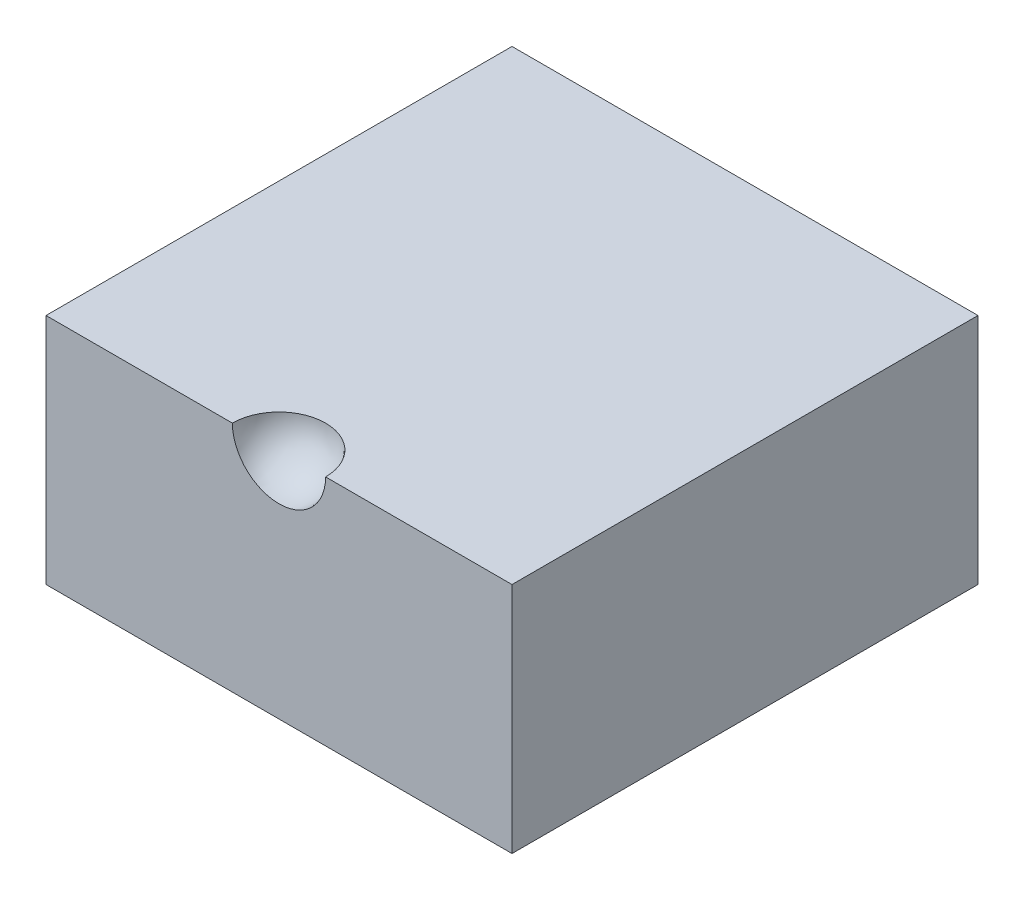
ISO-10303-21;
HEADER;
FILE_DESCRIPTION(('STEP AP214'),'2;1');
FILE_NAME('part.step','',(''),(''),'','','');
FILE_SCHEMA(('AUTOMOTIVE_DESIGN { 1 0 10303 214 1 1 1 1 }'));
ENDSEC;
DATA;
#1=APPLICATION_CONTEXT('core data for automotive mechanical design processes');
#2=APPLICATION_PROTOCOL_DEFINITION('international standard','automotive_design',2000,#1);
#3=PRODUCT_CONTEXT('',#1,'mechanical');
#4=PRODUCT('Part','Part','',(#3));
#5=PRODUCT_RELATED_PRODUCT_CATEGORY('part','',(#4));
#6=PRODUCT_DEFINITION_FORMATION('','',#4);
#7=PRODUCT_DEFINITION_CONTEXT('part definition',#1,'design');
#8=PRODUCT_DEFINITION('design','',#6,#7);
#9=PRODUCT_DEFINITION_SHAPE('','',#8);
#10=(LENGTH_UNIT() NAMED_UNIT(*) SI_UNIT(.MILLI.,.METRE.));
#11=(NAMED_UNIT(*) PLANE_ANGLE_UNIT() SI_UNIT($,.RADIAN.));
#12=(NAMED_UNIT(*) SI_UNIT($,.STERADIAN.) SOLID_ANGLE_UNIT());
#13=UNCERTAINTY_MEASURE_WITH_UNIT(LENGTH_MEASURE(1.E-05),#10,'distance_accuracy_value','');
#14=(GEOMETRIC_REPRESENTATION_CONTEXT(3) GLOBAL_UNCERTAINTY_ASSIGNED_CONTEXT((#13)) GLOBAL_UNIT_ASSIGNED_CONTEXT((#10,
#11,#12)) REPRESENTATION_CONTEXT('',''));
#15=CARTESIAN_POINT('',(0.,0.,0.));
#16=DIRECTION('',(0.,0.,1.));
#17=DIRECTION('',(1.,0.,0.));
#18=AXIS2_PLACEMENT_3D('',#15,#16,#17);
#19=CARTESIAN_POINT('',(25.,-25.,-25.));
#20=DIRECTION('',(1.,0.,0.));
#21=DIRECTION('',(0.,0.,-1.));
#22=AXIS2_PLACEMENT_3D('',#19,#20,#21);
#23=PLANE('',#22);
#24=DIRECTION('',(0.,0.,-1.));
#25=VECTOR('',#24,1.);
#26=CARTESIAN_POINT('',(25.,0.,-25.));
#27=LINE('',#26,#25);
#28=CARTESIAN_POINT('',(25.,0.,25.));
#29=VERTEX_POINT('',#28);
#30=CARTESIAN_POINT('',(25.,0.,-25.));
#31=VERTEX_POINT('',#30);
#32=EDGE_CURVE('E95',#29,#31,#27,.T.);
#33=ORIENTED_EDGE('',*,*,#32,.F.);
#34=DIRECTION('',(0.,1.,0.));
#35=VECTOR('',#34,1.);
#36=CARTESIAN_POINT('',(25.,-25.,25.));
#37=LINE('',#36,#35);
#38=CARTESIAN_POINT('',(25.,-25.,25.));
#39=VERTEX_POINT('',#38);
#40=EDGE_CURVE('E44',#39,#29,#37,.T.);
#41=ORIENTED_EDGE('',*,*,#40,.F.);
#42=DIRECTION('',(0.,0.,-1.));
#43=VECTOR('',#42,1.);
#44=CARTESIAN_POINT('',(25.,-25.,-25.));
#45=LINE('',#44,#43);
#46=CARTESIAN_POINT('',(25.,-25.,-25.));
#47=VERTEX_POINT('',#46);
#48=EDGE_CURVE('E102',#39,#47,#45,.T.);
#49=ORIENTED_EDGE('',*,*,#48,.T.);
#50=DIRECTION('',(0.,1.,0.));
#51=VECTOR('',#50,1.);
#52=CARTESIAN_POINT('',(25.,-25.,-25.));
#53=LINE('',#52,#51);
#54=EDGE_CURVE('E85',#47,#31,#53,.T.);
#55=ORIENTED_EDGE('',*,*,#54,.T.);
#56=EDGE_LOOP('',(#33,#41,#49,#55));
#57=FACE_BOUND('',#56,.T.);
#58=ADVANCED_FACE('F37',(#57),#23,.T.);
#59=CARTESIAN_POINT('',(-25.,-25.,25.));
#60=DIRECTION('',(0.,0.,1.));
#61=DIRECTION('',(1.,0.,0.));
#62=AXIS2_PLACEMENT_3D('',#59,#60,#61);
#63=PLANE('',#62);
#64=DIRECTION('',(1.,0.,0.));
#65=VECTOR('',#64,1.);
#66=CARTESIAN_POINT('',(-25.,0.,25.));
#67=LINE('',#66,#65);
#68=CARTESIAN_POINT('',(5.00000000000001,0.,25.));
#69=VERTEX_POINT('',#68);
#70=EDGE_CURVE('E79',#69,#29,#67,.T.);
#71=ORIENTED_EDGE('',*,*,#70,.F.);
#72=CARTESIAN_POINT('',(0.,0.,25.));
#73=DIRECTION('',(0.,0.,1.));
#74=DIRECTION('',(1.,0.,0.));
#75=AXIS2_PLACEMENT_3D('',#72,#73,#74);
#76=CIRCLE('',#75,5.);
#77=CARTESIAN_POINT('',(-4.99999999999999,0.,25.));
#78=VERTEX_POINT('',#77);
#79=EDGE_CURVE('E50',#69,#78,#76,.F.);
#80=ORIENTED_EDGE('',*,*,#79,.T.);
#81=CARTESIAN_POINT('',(-25.,0.,25.));
#82=VERTEX_POINT('',#81);
#83=EDGE_CURVE('E94',#82,#78,#67,.T.);
#84=ORIENTED_EDGE('',*,*,#83,.F.);
#85=DIRECTION('',(0.,1.,0.));
#86=VECTOR('',#85,1.);
#87=CARTESIAN_POINT('',(-25.,-25.,25.));
#88=LINE('',#87,#86);
#89=CARTESIAN_POINT('',(-25.,-25.,25.));
#90=VERTEX_POINT('',#89);
#91=EDGE_CURVE('E110',#90,#82,#88,.T.);
#92=ORIENTED_EDGE('',*,*,#91,.F.);
#93=DIRECTION('',(1.,0.,0.));
#94=VECTOR('',#93,1.);
#95=CARTESIAN_POINT('',(-25.,-25.,25.));
#96=LINE('',#95,#94);
#97=EDGE_CURVE('E113',#90,#39,#96,.T.);
#98=ORIENTED_EDGE('',*,*,#97,.T.);
#99=ORIENTED_EDGE('',*,*,#40,.T.);
#100=EDGE_LOOP('',(#71,#80,#84,#92,#98,#99));
#101=FACE_BOUND('',#100,.T.);
#102=ADVANCED_FACE('F93',(#101),#63,.T.);
#103=CARTESIAN_POINT('',(-25.,-25.,-25.));
#104=DIRECTION('',(-1.,0.,0.));
#105=DIRECTION('',(0.,0.,1.));
#106=AXIS2_PLACEMENT_3D('',#103,#104,#105);
#107=PLANE('',#106);
#108=DIRECTION('',(0.,0.,1.));
#109=VECTOR('',#108,1.);
#110=CARTESIAN_POINT('',(-25.,0.,-25.));
#111=LINE('',#110,#109);
#112=CARTESIAN_POINT('',(-25.,0.,-25.));
#113=VERTEX_POINT('',#112);
#114=EDGE_CURVE('E101',#113,#82,#111,.T.);
#115=ORIENTED_EDGE('',*,*,#114,.F.);
#116=DIRECTION('',(0.,1.,0.));
#117=VECTOR('',#116,1.);
#118=CARTESIAN_POINT('',(-25.,-25.,-25.));
#119=LINE('',#118,#117);
#120=CARTESIAN_POINT('',(-25.,-25.,-25.));
#121=VERTEX_POINT('',#120);
#122=EDGE_CURVE('E112',#121,#113,#119,.T.);
#123=ORIENTED_EDGE('',*,*,#122,.F.);
#124=DIRECTION('',(0.,0.,1.));
#125=VECTOR('',#124,1.);
#126=CARTESIAN_POINT('',(-25.,-25.,-25.));
#127=LINE('',#126,#125);
#128=EDGE_CURVE('E115',#121,#90,#127,.T.);
#129=ORIENTED_EDGE('',*,*,#128,.T.);
#130=ORIENTED_EDGE('',*,*,#91,.T.);
#131=EDGE_LOOP('',(#115,#123,#129,#130));
#132=FACE_BOUND('',#131,.T.);
#133=ADVANCED_FACE('F126',(#132),#107,.T.);
#134=CARTESIAN_POINT('',(-25.,-25.,-25.));
#135=DIRECTION('',(0.,0.,-1.));
#136=DIRECTION('',(-1.,0.,0.));
#137=AXIS2_PLACEMENT_3D('',#134,#135,#136);
#138=PLANE('',#137);
#139=DIRECTION('',(-1.,0.,0.));
#140=VECTOR('',#139,1.);
#141=CARTESIAN_POINT('',(-25.,0.,-25.));
#142=LINE('',#141,#140);
#143=EDGE_CURVE('E122',#31,#113,#142,.T.);
#144=ORIENTED_EDGE('',*,*,#143,.F.);
#145=ORIENTED_EDGE('',*,*,#54,.F.);
#146=DIRECTION('',(-1.,0.,0.));
#147=VECTOR('',#146,1.);
#148=CARTESIAN_POINT('',(-25.,-25.,-25.));
#149=LINE('',#148,#147);
#150=EDGE_CURVE('E104',#47,#121,#149,.T.);
#151=ORIENTED_EDGE('',*,*,#150,.T.);
#152=ORIENTED_EDGE('',*,*,#122,.T.);
#153=EDGE_LOOP('',(#144,#145,#151,#152));
#154=FACE_BOUND('',#153,.T.);
#155=ADVANCED_FACE('F123',(#154),#138,.T.);
#156=CARTESIAN_POINT('',(0.,-25.,0.));
#157=DIRECTION('',(0.,1.,0.));
#158=DIRECTION('',(0.,0.,1.));
#159=AXIS2_PLACEMENT_3D('',#156,#157,#158);
#160=PLANE('',#159);
#161=ORIENTED_EDGE('',*,*,#48,.F.);
#162=ORIENTED_EDGE('',*,*,#97,.F.);
#163=ORIENTED_EDGE('',*,*,#128,.F.);
#164=ORIENTED_EDGE('',*,*,#150,.F.);
#165=EDGE_LOOP('',(#161,#162,#163,#164));
#166=FACE_BOUND('',#165,.T.);
#167=ADVANCED_FACE('F128',(#166),#160,.F.);
#168=CARTESIAN_POINT('',(0.,0.,0.));
#169=DIRECTION('',(0.,1.,0.));
#170=DIRECTION('',(0.,0.,1.));
#171=AXIS2_PLACEMENT_3D('',#168,#169,#170);
#172=PLANE('',#171);
#173=ORIENTED_EDGE('',*,*,#83,.T.);
#174=CARTESIAN_POINT('',(0.,0.,25.));
#175=DIRECTION('',(0.,1.,0.));
#176=DIRECTION('',(0.,0.,1.));
#177=AXIS2_PLACEMENT_3D('',#174,#175,#176);
#178=CIRCLE('',#177,5.);
#179=EDGE_CURVE('E11',#78,#69,#178,.F.);
#180=ORIENTED_EDGE('',*,*,#179,.T.);
#181=ORIENTED_EDGE('',*,*,#70,.T.);
#182=ORIENTED_EDGE('',*,*,#32,.T.);
#183=ORIENTED_EDGE('',*,*,#143,.T.);
#184=ORIENTED_EDGE('',*,*,#114,.T.);
#185=EDGE_LOOP('',(#173,#180,#181,#182,#183,#184));
#186=FACE_BOUND('',#185,.T.);
#187=ADVANCED_FACE('F98',(#186),#172,.T.);
#188=CARTESIAN_POINT('',(0.,0.,25.));
#189=DIRECTION('',(-1.,0.,0.));
#190=DIRECTION('',(0.,0.,-1.));
#191=AXIS2_PLACEMENT_3D('',#188,#189,#190);
#192=SPHERICAL_SURFACE('',#191,5.);
#193=ORIENTED_EDGE('',*,*,#179,.F.);
#194=ORIENTED_EDGE('',*,*,#79,.F.);
#195=EDGE_LOOP('',(#193,#194));
#196=FACE_BOUND('',#195,.T.);
#197=ADVANCED_FACE('F89',(#196),#192,.F.);
#198=CLOSED_SHELL('',(#58,#102,#133,#155,#167,#187,#197));
#199=MANIFOLD_SOLID_BREP('B2',#198);
#200=ADVANCED_BREP_SHAPE_REPRESENTATION('',(#18,#199),#14);
#201=SHAPE_DEFINITION_REPRESENTATION(#9,#200);
ENDSEC;
END-ISO-10303-21;
